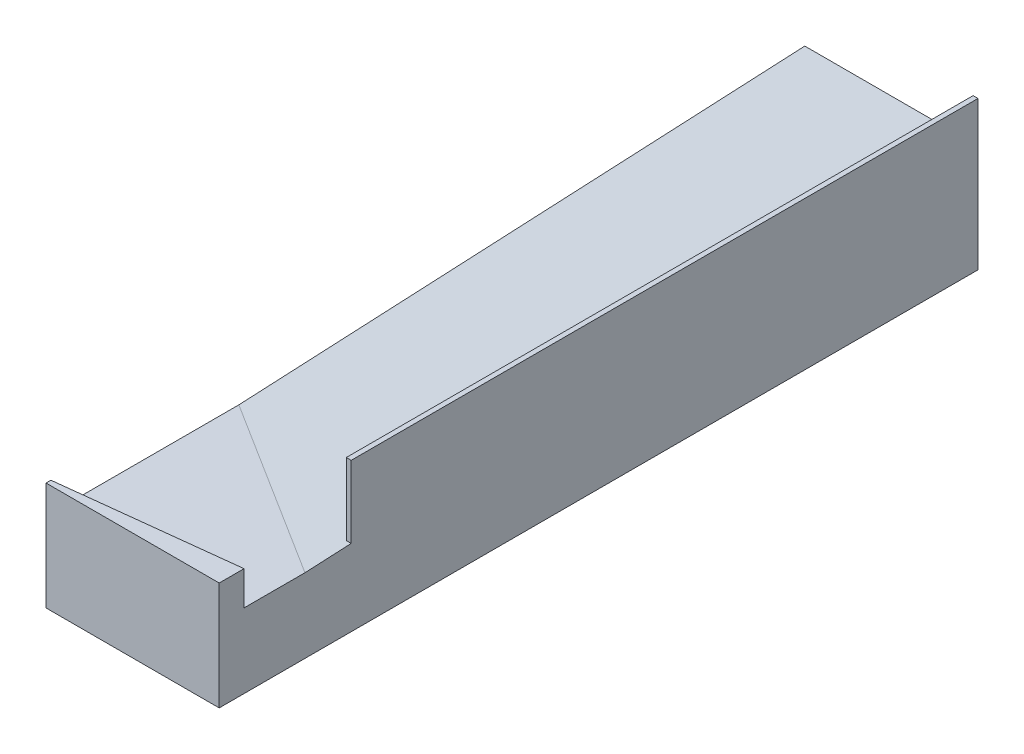
ISO-10303-21;
HEADER;
FILE_DESCRIPTION(('STEP AP214'),'2;1');
FILE_NAME('part.step','',(''),(''),'','','');
FILE_SCHEMA(('AUTOMOTIVE_DESIGN { 1 0 10303 214 1 1 1 1 }'));
ENDSEC;
DATA;
#1=APPLICATION_CONTEXT('core data for automotive mechanical design processes');
#2=APPLICATION_PROTOCOL_DEFINITION('international standard','automotive_design',2000,#1);
#3=PRODUCT_CONTEXT('',#1,'mechanical');
#4=PRODUCT('Part','Part','',(#3));
#5=PRODUCT_RELATED_PRODUCT_CATEGORY('part','',(#4));
#6=PRODUCT_DEFINITION_FORMATION('','',#4);
#7=PRODUCT_DEFINITION_CONTEXT('part definition',#1,'design');
#8=PRODUCT_DEFINITION('design','',#6,#7);
#9=PRODUCT_DEFINITION_SHAPE('','',#8);
#10=(LENGTH_UNIT() NAMED_UNIT(*) SI_UNIT(.MILLI.,.METRE.));
#11=(NAMED_UNIT(*) PLANE_ANGLE_UNIT() SI_UNIT($,.RADIAN.));
#12=(NAMED_UNIT(*) SI_UNIT($,.STERADIAN.) SOLID_ANGLE_UNIT());
#13=UNCERTAINTY_MEASURE_WITH_UNIT(LENGTH_MEASURE(1.E-05),#10,'distance_accuracy_value','');
#14=(GEOMETRIC_REPRESENTATION_CONTEXT(3) GLOBAL_UNCERTAINTY_ASSIGNED_CONTEXT((#13)) GLOBAL_UNIT_ASSIGNED_CONTEXT((#10,
#11,#12)) REPRESENTATION_CONTEXT('',''));
#15=CARTESIAN_POINT('',(0.,0.,0.));
#16=DIRECTION('',(0.,0.,1.));
#17=DIRECTION('',(1.,0.,0.));
#18=AXIS2_PLACEMENT_3D('',#15,#16,#17);
#19=CARTESIAN_POINT('',(285.75,0.,0.));
#20=DIRECTION('',(-1.,0.,0.));
#21=DIRECTION('',(0.,0.,1.));
#22=AXIS2_PLACEMENT_3D('',#19,#20,#21);
#23=PLANE('',#22);
#24=DIRECTION('',(0.,1.,0.));
#25=VECTOR('',#24,1.);
#26=CARTESIAN_POINT('',(285.75,0.,-584.2));
#27=LINE('',#26,#25);
#28=CARTESIAN_POINT('',(285.75,0.,-584.2));
#29=VERTEX_POINT('',#28);
#30=CARTESIAN_POINT('',(285.75,82.55,-584.2));
#31=VERTEX_POINT('',#30);
#32=EDGE_CURVE('E196',#29,#31,#27,.T.);
#33=ORIENTED_EDGE('',*,*,#32,.F.);
#34=DIRECTION('',(0.,0.,-1.));
#35=VECTOR('',#34,1.);
#36=CARTESIAN_POINT('',(285.75,0.,-584.2));
#37=LINE('',#36,#35);
#38=CARTESIAN_POINT('',(285.75,0.,0.));
#39=VERTEX_POINT('',#38);
#40=EDGE_CURVE('E199',#39,#29,#37,.T.);
#41=ORIENTED_EDGE('',*,*,#40,.F.);
#42=DIRECTION('',(0.,1.,0.));
#43=VECTOR('',#42,1.);
#44=CARTESIAN_POINT('',(285.75,0.,0.));
#45=LINE('',#44,#43);
#46=CARTESIAN_POINT('',(285.75,83.312,0.));
#47=VERTEX_POINT('',#46);
#48=EDGE_CURVE('E146',#39,#47,#45,.T.);
#49=ORIENTED_EDGE('',*,*,#48,.T.);
#50=DIRECTION('',(0.,0.,-1.));
#51=VECTOR('',#50,1.);
#52=CARTESIAN_POINT('',(285.75,83.312,0.));
#53=LINE('',#52,#51);
#54=CARTESIAN_POINT('',(285.75,83.312,-3.74645109826675));
#55=VERTEX_POINT('',#54);
#56=EDGE_CURVE('E130',#47,#55,#53,.T.);
#57=ORIENTED_EDGE('',*,*,#56,.T.);
#58=DIRECTION('',(0.,-1.,0.));
#59=VECTOR('',#58,1.);
#60=CARTESIAN_POINT('',(285.75,83.312,-3.74645109826675));
#61=LINE('',#60,#59);
#62=CARTESIAN_POINT('',(285.75,61.1909090909092,-3.74645109826675));
#63=VERTEX_POINT('',#62);
#64=EDGE_CURVE('E140',#55,#63,#61,.T.);
#65=ORIENTED_EDGE('',*,*,#64,.T.);
#66=DIRECTION('',(0.,0.,1.));
#67=VECTOR('',#66,1.);
#68=CARTESIAN_POINT('',(285.75,61.1909090909092,-584.2));
#69=LINE('',#68,#67);
#70=CARTESIAN_POINT('',(285.75,61.1909090909092,-148.474545454545));
#71=VERTEX_POINT('',#70);
#72=EDGE_CURVE('E202',#71,#63,#69,.T.);
#73=ORIENTED_EDGE('',*,*,#72,.F.);
#74=DIRECTION('',(0.,-0.0489608186254638,0.998800699959469));
#75=VECTOR('',#74,1.);
#76=CARTESIAN_POINT('',(285.75,82.55,-584.2));
#77=LINE('',#76,#75);
#78=EDGE_CURVE('E205',#31,#71,#77,.T.);
#79=ORIENTED_EDGE('',*,*,#78,.F.);
#80=EDGE_LOOP('',(#33,#41,#49,#57,#65,#73,#79));
#81=FACE_BOUND('',#80,.T.);
#82=ADVANCED_FACE('F42',(#81),#23,.T.);
#83=CARTESIAN_POINT('',(415.33308629776,114.3,-101.6));
#84=DIRECTION('',(0.,0.,-1.));
#85=DIRECTION('',(-1.,0.,0.));
#86=AXIS2_PLACEMENT_3D('',#83,#84,#85);
#87=PLANE('',#86);
#88=DIRECTION('',(-1.,0.,0.));
#89=VECTOR('',#88,1.);
#90=CARTESIAN_POINT('',(-943.794471192522,58.8931372549021,-101.6));
#91=LINE('',#90,#89);
#92=CARTESIAN_POINT('',(419.1,58.8931372549021,-101.6));
#93=VERTEX_POINT('',#92);
#94=CARTESIAN_POINT('',(415.33308629776,58.8931372549021,-101.6));
#95=VERTEX_POINT('',#94);
#96=EDGE_CURVE('E180',#93,#95,#91,.T.);
#97=ORIENTED_EDGE('',*,*,#96,.F.);
#98=DIRECTION('',(0.,-1.,0.));
#99=VECTOR('',#98,1.);
#100=CARTESIAN_POINT('',(419.1,114.3,-101.6));
#101=LINE('',#100,#99);
#102=CARTESIAN_POINT('',(419.1,114.3,-101.6));
#103=VERTEX_POINT('',#102);
#104=EDGE_CURVE('E60',#103,#93,#101,.T.);
#105=ORIENTED_EDGE('',*,*,#104,.F.);
#106=DIRECTION('',(1.,0.,0.));
#107=VECTOR('',#106,1.);
#108=CARTESIAN_POINT('',(415.33308629776,114.3,-101.6));
#109=LINE('',#108,#107);
#110=CARTESIAN_POINT('',(415.33308629776,114.3,-101.6));
#111=VERTEX_POINT('',#110);
#112=EDGE_CURVE('E224',#111,#103,#109,.T.);
#113=ORIENTED_EDGE('',*,*,#112,.F.);
#114=DIRECTION('',(0.,-1.,0.));
#115=VECTOR('',#114,1.);
#116=CARTESIAN_POINT('',(415.33308629776,114.3,-101.6));
#117=LINE('',#116,#115);
#118=EDGE_CURVE('E214',#111,#95,#117,.T.);
#119=ORIENTED_EDGE('',*,*,#118,.T.);
#120=EDGE_LOOP('',(#97,#105,#113,#119));
#121=FACE_BOUND('',#120,.T.);
#122=ADVANCED_FACE('F242',(#121),#87,.F.);
#123=CARTESIAN_POINT('',(-419.1,82.55,-584.2));
#124=DIRECTION('',(0.0302891266407689,0.999541179145381,0.));
#125=DIRECTION('',(-0.999541179145382,0.030289126640769,0.));
#126=AXIS2_PLACEMENT_3D('',#123,#124,#125);
#127=PLANE('',#126);
#128=DIRECTION('',(0.850312150745116,-0.025767034871064,0.525647511369709));
#129=VECTOR('',#128,1.);
#130=CARTESIAN_POINT('',(-419.1,82.55,-584.2));
#131=LINE('',#130,#129);
#132=CARTESIAN_POINT('',(419.1,57.1500000000002,-66.04));
#133=VERTEX_POINT('',#132);
#134=EDGE_CURVE('E167',#71,#133,#131,.T.);
#135=ORIENTED_EDGE('',*,*,#134,.F.);
#136=ORIENTED_EDGE('',*,*,#72,.T.);
#137=DIRECTION('',(0.992962268681576,-0.0300897657176233,-0.114544921204726));
#138=VECTOR('',#137,1.);
#139=CARTESIAN_POINT('',(-343.831906804647,80.2691486910499,68.8800848552211));
#140=LINE('',#139,#138);
#141=CARTESIAN_POINT('',(419.1,57.1500000000002,-19.1292765332465));
#142=VERTEX_POINT('',#141);
#143=EDGE_CURVE('E142',#63,#142,#140,.T.);
#144=ORIENTED_EDGE('',*,*,#143,.T.);
#145=DIRECTION('',(0.,0.,1.));
#146=VECTOR('',#145,1.);
#147=CARTESIAN_POINT('',(419.1,57.1500000000002,-584.2));
#148=LINE('',#147,#146);
#149=EDGE_CURVE('E11',#133,#142,#148,.T.);
#150=ORIENTED_EDGE('',*,*,#149,.F.);
#151=EDGE_LOOP('',(#135,#136,#144,#150));
#152=FACE_BOUND('',#151,.T.);
#153=ADVANCED_FACE('F257',(#152),#127,.T.);
#154=CARTESIAN_POINT('',(419.1,83.312,-19.1292765332465));
#155=DIRECTION('',(0.114596810584884,0.,0.993412085191122));
#156=DIRECTION('',(0.993412085191122,0.,-0.114596810584884));
#157=AXIS2_PLACEMENT_3D('',#154,#155,#156);
#158=PLANE('',#157);
#159=ORIENTED_EDGE('',*,*,#64,.F.);
#160=DIRECTION('',(-0.993412085191122,0.,0.114596810584884));
#161=VECTOR('',#160,1.);
#162=CARTESIAN_POINT('',(419.1,83.312,-19.1292765332465));
#163=LINE('',#162,#161);
#164=CARTESIAN_POINT('',(419.1,83.312,-19.1292765332465));
#165=VERTEX_POINT('',#164);
#166=EDGE_CURVE('E126',#165,#55,#163,.T.);
#167=ORIENTED_EDGE('',*,*,#166,.F.);
#168=DIRECTION('',(0.,-1.,0.));
#169=VECTOR('',#168,1.);
#170=CARTESIAN_POINT('',(419.1,83.312,-19.1292765332465));
#171=LINE('',#170,#169);
#172=EDGE_CURVE('E157',#165,#142,#171,.T.);
#173=ORIENTED_EDGE('',*,*,#172,.T.);
#174=ORIENTED_EDGE('',*,*,#143,.F.);
#175=EDGE_LOOP('',(#159,#167,#173,#174));
#176=FACE_BOUND('',#175,.T.);
#177=ADVANCED_FACE('F141',(#176),#158,.F.);
#178=CARTESIAN_POINT('',(419.1,57.1500000000002,-584.2));
#179=DIRECTION('',(1.,0.,0.));
#180=DIRECTION('',(0.,0.,-1.));
#181=AXIS2_PLACEMENT_3D('',#178,#179,#180);
#182=PLANE('',#181);
#183=DIRECTION('',(0.,1.,0.));
#184=VECTOR('',#183,1.);
#185=CARTESIAN_POINT('',(419.1,57.1500000000002,0.));
#186=LINE('',#185,#184);
#187=CARTESIAN_POINT('',(419.1,0.,0.));
#188=VERTEX_POINT('',#187);
#189=CARTESIAN_POINT('',(419.1,83.312,0.));
#190=VERTEX_POINT('',#189);
#191=EDGE_CURVE('E164',#188,#190,#186,.T.);
#192=ORIENTED_EDGE('',*,*,#191,.F.);
#193=DIRECTION('',(0.,0.,1.));
#194=VECTOR('',#193,1.);
#195=CARTESIAN_POINT('',(419.1,0.,-584.2));
#196=LINE('',#195,#194);
#197=CARTESIAN_POINT('',(419.1,0.,-584.2));
#198=VERTEX_POINT('',#197);
#199=EDGE_CURVE('E52',#198,#188,#196,.T.);
#200=ORIENTED_EDGE('',*,*,#199,.F.);
#201=DIRECTION('',(0.,1.,0.));
#202=VECTOR('',#201,1.);
#203=CARTESIAN_POINT('',(419.1,57.1500000000002,-584.2));
#204=LINE('',#203,#202);
#205=CARTESIAN_POINT('',(419.1,114.3,-584.2));
#206=VERTEX_POINT('',#205);
#207=EDGE_CURVE('E163',#198,#206,#204,.T.);
#208=ORIENTED_EDGE('',*,*,#207,.T.);
#209=DIRECTION('',(0.,0.,-1.));
#210=VECTOR('',#209,1.);
#211=CARTESIAN_POINT('',(419.1,114.3,-584.2));
#212=LINE('',#211,#210);
#213=EDGE_CURVE('E220',#103,#206,#212,.T.);
#214=ORIENTED_EDGE('',*,*,#213,.F.);
#215=ORIENTED_EDGE('',*,*,#104,.T.);
#216=DIRECTION('',(0.,-0.0489608186254638,0.998800699959469));
#217=VECTOR('',#216,1.);
#218=CARTESIAN_POINT('',(419.1,82.55,-584.2));
#219=LINE('',#218,#217);
#220=EDGE_CURVE('E174',#93,#133,#219,.T.);
#221=ORIENTED_EDGE('',*,*,#220,.T.);
#222=ORIENTED_EDGE('',*,*,#149,.T.);
#223=ORIENTED_EDGE('',*,*,#172,.F.);
#224=DIRECTION('',(0.,0.,-1.));
#225=VECTOR('',#224,1.);
#226=CARTESIAN_POINT('',(419.1,83.312,0.));
#227=LINE('',#226,#225);
#228=EDGE_CURVE('E132',#190,#165,#227,.T.);
#229=ORIENTED_EDGE('',*,*,#228,.F.);
#230=EDGE_LOOP('',(#192,#200,#208,#214,#215,#221,#222,#223,#229));
#231=FACE_BOUND('',#230,.T.);
#232=ADVANCED_FACE('F268',(#231),#182,.T.);
#233=CARTESIAN_POINT('',(0.,0.,0.));
#234=DIRECTION('',(0.,0.,-1.));
#235=DIRECTION('',(-1.,0.,0.));
#236=AXIS2_PLACEMENT_3D('',#233,#234,#235);
#237=PLANE('',#236);
#238=ORIENTED_EDGE('',*,*,#48,.F.);
#239=DIRECTION('',(1.,0.,0.));
#240=VECTOR('',#239,1.);
#241=CARTESIAN_POINT('',(-419.1,0.,0.));
#242=LINE('',#241,#240);
#243=EDGE_CURVE('E165',#39,#188,#242,.T.);
#244=ORIENTED_EDGE('',*,*,#243,.T.);
#245=ORIENTED_EDGE('',*,*,#191,.T.);
#246=DIRECTION('',(1.,0.,0.));
#247=VECTOR('',#246,1.);
#248=CARTESIAN_POINT('',(253.272919891048,83.312,0.));
#249=LINE('',#248,#247);
#250=EDGE_CURVE('E137',#47,#190,#249,.T.);
#251=ORIENTED_EDGE('',*,*,#250,.F.);
#252=EDGE_LOOP('',(#238,#244,#245,#251));
#253=FACE_BOUND('',#252,.T.);
#254=ADVANCED_FACE('F44',(#253),#237,.F.);
#255=CARTESIAN_POINT('',(0.,83.312,0.));
#256=DIRECTION('',(0.,-1.,0.));
#257=DIRECTION('',(0.,0.,-1.));
#258=AXIS2_PLACEMENT_3D('',#255,#256,#257);
#259=PLANE('',#258);
#260=ORIENTED_EDGE('',*,*,#56,.F.);
#261=ORIENTED_EDGE('',*,*,#250,.T.);
#262=ORIENTED_EDGE('',*,*,#228,.T.);
#263=ORIENTED_EDGE('',*,*,#166,.T.);
#264=EDGE_LOOP('',(#260,#261,#262,#263));
#265=FACE_BOUND('',#264,.T.);
#266=ADVANCED_FACE('F128',(#265),#259,.F.);
#267=CARTESIAN_POINT('',(0.,114.3,0.));
#268=DIRECTION('',(0.,-1.,0.));
#269=DIRECTION('',(0.,0.,-1.));
#270=AXIS2_PLACEMENT_3D('',#267,#268,#269);
#271=PLANE('',#270);
#272=DIRECTION('',(-1.,0.,0.));
#273=VECTOR('',#272,1.);
#274=CARTESIAN_POINT('',(415.33308629776,114.3,-584.2));
#275=LINE('',#274,#273);
#276=CARTESIAN_POINT('',(415.33308629776,114.3,-584.2));
#277=VERTEX_POINT('',#276);
#278=EDGE_CURVE('E230',#206,#277,#275,.T.);
#279=ORIENTED_EDGE('',*,*,#278,.T.);
#280=DIRECTION('',(0.,0.,1.));
#281=VECTOR('',#280,1.);
#282=CARTESIAN_POINT('',(415.33308629776,114.3,-579.638290513834));
#283=LINE('',#282,#281);
#284=EDGE_CURVE('E227',#277,#111,#283,.T.);
#285=ORIENTED_EDGE('',*,*,#284,.T.);
#286=ORIENTED_EDGE('',*,*,#112,.T.);
#287=ORIENTED_EDGE('',*,*,#213,.T.);
#288=EDGE_LOOP('',(#279,#285,#286,#287));
#289=FACE_BOUND('',#288,.T.);
#290=ADVANCED_FACE('F244',(#289),#271,.F.);
#291=CARTESIAN_POINT('',(415.33308629776,114.3,-579.638290513834));
#292=DIRECTION('',(1.,0.,0.));
#293=DIRECTION('',(0.,0.,-1.));
#294=AXIS2_PLACEMENT_3D('',#291,#292,#293);
#295=PLANE('',#294);
#296=DIRECTION('',(0.,0.0489608186254638,-0.998800699959469));
#297=VECTOR('',#296,1.);
#298=CARTESIAN_POINT('',(415.33308629776,82.55,-584.2));
#299=LINE('',#298,#297);
#300=CARTESIAN_POINT('',(415.33308629776,82.55,-584.2));
#301=VERTEX_POINT('',#300);
#302=EDGE_CURVE('E185',#95,#301,#299,.T.);
#303=ORIENTED_EDGE('',*,*,#302,.F.);
#304=ORIENTED_EDGE('',*,*,#118,.F.);
#305=ORIENTED_EDGE('',*,*,#284,.F.);
#306=DIRECTION('',(0.,-1.,0.));
#307=VECTOR('',#306,1.);
#308=CARTESIAN_POINT('',(415.33308629776,114.3,-584.2));
#309=LINE('',#308,#307);
#310=EDGE_CURVE('E160',#277,#301,#309,.T.);
#311=ORIENTED_EDGE('',*,*,#310,.T.);
#312=EDGE_LOOP('',(#303,#304,#305,#311));
#313=FACE_BOUND('',#312,.T.);
#314=ADVANCED_FACE('F239',(#313),#295,.F.);
#315=CARTESIAN_POINT('',(-943.794471192522,82.55,-584.2));
#316=DIRECTION('',(0.,0.998800699959469,0.0489608186254638));
#317=DIRECTION('',(0.,-0.0489608186254638,0.998800699959469));
#318=AXIS2_PLACEMENT_3D('',#315,#316,#317);
#319=PLANE('',#318);
#320=DIRECTION('',(1.,0.,0.));
#321=VECTOR('',#320,1.);
#322=CARTESIAN_POINT('',(-943.794471192522,82.55,-584.2));
#323=LINE('',#322,#321);
#324=EDGE_CURVE('E46',#31,#301,#323,.T.);
#325=ORIENTED_EDGE('',*,*,#324,.F.);
#326=ORIENTED_EDGE('',*,*,#78,.T.);
#327=ORIENTED_EDGE('',*,*,#134,.T.);
#328=ORIENTED_EDGE('',*,*,#220,.F.);
#329=ORIENTED_EDGE('',*,*,#96,.T.);
#330=ORIENTED_EDGE('',*,*,#302,.T.);
#331=EDGE_LOOP('',(#325,#326,#327,#328,#329,#330));
#332=FACE_BOUND('',#331,.T.);
#333=ADVANCED_FACE('F236',(#332),#319,.T.);
#334=CARTESIAN_POINT('',(-419.1,0.,-584.2));
#335=DIRECTION('',(0.,-1.,0.));
#336=DIRECTION('',(0.,0.,-1.));
#337=AXIS2_PLACEMENT_3D('',#334,#335,#336);
#338=PLANE('',#337);
#339=ORIENTED_EDGE('',*,*,#243,.F.);
#340=ORIENTED_EDGE('',*,*,#40,.T.);
#341=DIRECTION('',(1.,0.,0.));
#342=VECTOR('',#341,1.);
#343=CARTESIAN_POINT('',(-419.1,0.,-584.2));
#344=LINE('',#343,#342);
#345=EDGE_CURVE('E69',#29,#198,#344,.T.);
#346=ORIENTED_EDGE('',*,*,#345,.T.);
#347=ORIENTED_EDGE('',*,*,#199,.T.);
#348=EDGE_LOOP('',(#339,#340,#346,#347));
#349=FACE_BOUND('',#348,.T.);
#350=ADVANCED_FACE('F249',(#349),#338,.T.);
#351=CARTESIAN_POINT('',(0.,0.,-584.2));
#352=DIRECTION('',(0.,0.,-1.));
#353=DIRECTION('',(-1.,0.,0.));
#354=AXIS2_PLACEMENT_3D('',#351,#352,#353);
#355=PLANE('',#354);
#356=ORIENTED_EDGE('',*,*,#345,.F.);
#357=ORIENTED_EDGE('',*,*,#32,.T.);
#358=ORIENTED_EDGE('',*,*,#324,.T.);
#359=ORIENTED_EDGE('',*,*,#310,.F.);
#360=ORIENTED_EDGE('',*,*,#278,.F.);
#361=ORIENTED_EDGE('',*,*,#207,.F.);
#362=EDGE_LOOP('',(#356,#357,#358,#359,#360,#361));
#363=FACE_BOUND('',#362,.T.);
#364=ADVANCED_FACE('F247',(#363),#355,.T.);
#365=CLOSED_SHELL('',(#82,#122,#153,#177,#232,#254,#266,#290,#314,#333,#350,#364));
#366=MANIFOLD_SOLID_BREP('B2',#365);
#367=ADVANCED_BREP_SHAPE_REPRESENTATION('',(#18,#366),#14);
#368=SHAPE_DEFINITION_REPRESENTATION(#9,#367);
ENDSEC;
END-ISO-10303-21;
